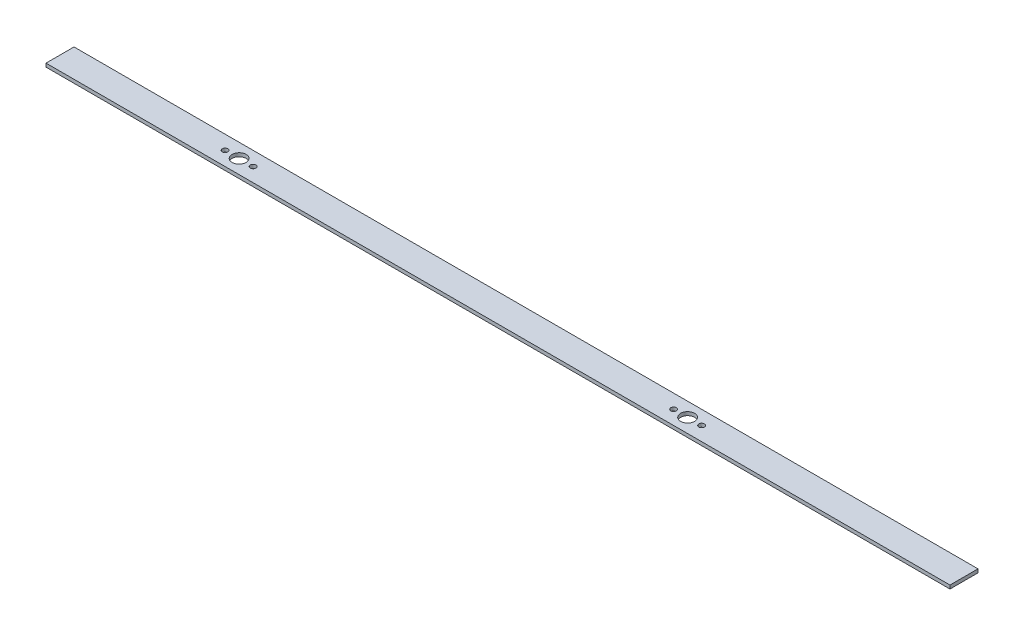
ISO-10303-21;
HEADER;
FILE_DESCRIPTION(('STEP AP214'),'2;1');
FILE_NAME('part.step','',(''),(''),'','','');
FILE_SCHEMA(('AUTOMOTIVE_DESIGN { 1 0 10303 214 1 1 1 1 }'));
ENDSEC;
DATA;
#1=APPLICATION_CONTEXT('core data for automotive mechanical design processes');
#2=APPLICATION_PROTOCOL_DEFINITION('international standard','automotive_design',2000,#1);
#3=PRODUCT_CONTEXT('',#1,'mechanical');
#4=PRODUCT('Part','Part','',(#3));
#5=PRODUCT_RELATED_PRODUCT_CATEGORY('part','',(#4));
#6=PRODUCT_DEFINITION_FORMATION('','',#4);
#7=PRODUCT_DEFINITION_CONTEXT('part definition',#1,'design');
#8=PRODUCT_DEFINITION('design','',#6,#7);
#9=PRODUCT_DEFINITION_SHAPE('','',#8);
#10=(LENGTH_UNIT() NAMED_UNIT(*) SI_UNIT(.MILLI.,.METRE.));
#11=(NAMED_UNIT(*) PLANE_ANGLE_UNIT() SI_UNIT($,.RADIAN.));
#12=(NAMED_UNIT(*) SI_UNIT($,.STERADIAN.) SOLID_ANGLE_UNIT());
#13=UNCERTAINTY_MEASURE_WITH_UNIT(LENGTH_MEASURE(1.E-05),#10,'distance_accuracy_value','');
#14=(GEOMETRIC_REPRESENTATION_CONTEXT(3) GLOBAL_UNCERTAINTY_ASSIGNED_CONTEXT((#13)) GLOBAL_UNIT_ASSIGNED_CONTEXT((#10,
#11,#12)) REPRESENTATION_CONTEXT('',''));
#15=CARTESIAN_POINT('',(0.,0.,0.));
#16=DIRECTION('',(0.,0.,1.));
#17=DIRECTION('',(1.,0.,0.));
#18=AXIS2_PLACEMENT_3D('',#15,#16,#17);
#19=CARTESIAN_POINT('',(0.,3.175,0.));
#20=DIRECTION('',(1.,0.,0.));
#21=DIRECTION('',(0.,0.,-1.));
#22=AXIS2_PLACEMENT_3D('',#19,#20,#21);
#23=PLANE('',#22);
#24=DIRECTION('',(0.,0.,1.));
#25=VECTOR('',#24,1.);
#26=CARTESIAN_POINT('',(0.,0.,0.));
#27=LINE('',#26,#25);
#28=CARTESIAN_POINT('',(0.,0.,-25.4));
#29=VERTEX_POINT('',#28);
#30=CARTESIAN_POINT('',(0.,0.,0.));
#31=VERTEX_POINT('',#30);
#32=EDGE_CURVE('E115',#29,#31,#27,.T.);
#33=ORIENTED_EDGE('',*,*,#32,.T.);
#34=DIRECTION('',(0.,-1.,0.));
#35=VECTOR('',#34,1.);
#36=CARTESIAN_POINT('',(0.,3.175,0.));
#37=LINE('',#36,#35);
#38=CARTESIAN_POINT('',(0.,3.175,0.));
#39=VERTEX_POINT('',#38);
#40=EDGE_CURVE('E11',#39,#31,#37,.T.);
#41=ORIENTED_EDGE('',*,*,#40,.F.);
#42=DIRECTION('',(0.,0.,1.));
#43=VECTOR('',#42,1.);
#44=CARTESIAN_POINT('',(0.,3.175,0.));
#45=LINE('',#44,#43);
#46=CARTESIAN_POINT('',(0.,3.175,-25.4));
#47=VERTEX_POINT('',#46);
#48=EDGE_CURVE('E98',#47,#39,#45,.T.);
#49=ORIENTED_EDGE('',*,*,#48,.F.);
#50=DIRECTION('',(0.,-1.,0.));
#51=VECTOR('',#50,1.);
#52=CARTESIAN_POINT('',(0.,3.175,-25.4));
#53=LINE('',#52,#51);
#54=EDGE_CURVE('E111',#47,#29,#53,.T.);
#55=ORIENTED_EDGE('',*,*,#54,.T.);
#56=EDGE_LOOP('',(#33,#41,#49,#55));
#57=FACE_BOUND('',#56,.T.);
#58=ADVANCED_FACE('F41',(#57),#23,.F.);
#59=CARTESIAN_POINT('',(0.,3.175,0.));
#60=DIRECTION('',(0.,0.,-1.));
#61=DIRECTION('',(-1.,0.,0.));
#62=AXIS2_PLACEMENT_3D('',#59,#60,#61);
#63=PLANE('',#62);
#64=DIRECTION('',(1.,0.,0.));
#65=VECTOR('',#64,1.);
#66=CARTESIAN_POINT('',(0.,0.,0.));
#67=LINE('',#66,#65);
#68=CARTESIAN_POINT('',(819.15,0.,0.));
#69=VERTEX_POINT('',#68);
#70=EDGE_CURVE('E103',#31,#69,#67,.T.);
#71=ORIENTED_EDGE('',*,*,#70,.T.);
#72=DIRECTION('',(0.,-1.,0.));
#73=VECTOR('',#72,1.);
#74=CARTESIAN_POINT('',(819.15,3.175,0.));
#75=LINE('',#74,#73);
#76=CARTESIAN_POINT('',(819.15,3.175,0.));
#77=VERTEX_POINT('',#76);
#78=EDGE_CURVE('E50',#77,#69,#75,.T.);
#79=ORIENTED_EDGE('',*,*,#78,.F.);
#80=DIRECTION('',(1.,0.,0.));
#81=VECTOR('',#80,1.);
#82=CARTESIAN_POINT('',(0.,3.175,0.));
#83=LINE('',#82,#81);
#84=EDGE_CURVE('E93',#39,#77,#83,.T.);
#85=ORIENTED_EDGE('',*,*,#84,.F.);
#86=ORIENTED_EDGE('',*,*,#40,.T.);
#87=EDGE_LOOP('',(#71,#79,#85,#86));
#88=FACE_BOUND('',#87,.T.);
#89=ADVANCED_FACE('F102',(#88),#63,.F.);
#90=CARTESIAN_POINT('',(819.15,3.175,0.));
#91=DIRECTION('',(-1.,0.,0.));
#92=DIRECTION('',(0.,0.,1.));
#93=AXIS2_PLACEMENT_3D('',#90,#91,#92);
#94=PLANE('',#93);
#95=DIRECTION('',(0.,0.,-1.));
#96=VECTOR('',#95,1.);
#97=CARTESIAN_POINT('',(819.15,0.,0.));
#98=LINE('',#97,#96);
#99=CARTESIAN_POINT('',(819.15,0.,-25.4));
#100=VERTEX_POINT('',#99);
#101=EDGE_CURVE('E79',#69,#100,#98,.T.);
#102=ORIENTED_EDGE('',*,*,#101,.T.);
#103=DIRECTION('',(0.,-1.,0.));
#104=VECTOR('',#103,1.);
#105=CARTESIAN_POINT('',(819.15,3.175,-25.4));
#106=LINE('',#105,#104);
#107=CARTESIAN_POINT('',(819.15,3.175,-25.4));
#108=VERTEX_POINT('',#107);
#109=EDGE_CURVE('E104',#108,#100,#106,.T.);
#110=ORIENTED_EDGE('',*,*,#109,.F.);
#111=DIRECTION('',(0.,0.,-1.));
#112=VECTOR('',#111,1.);
#113=CARTESIAN_POINT('',(819.15,3.175,0.));
#114=LINE('',#113,#112);
#115=EDGE_CURVE('E96',#77,#108,#114,.T.);
#116=ORIENTED_EDGE('',*,*,#115,.F.);
#117=ORIENTED_EDGE('',*,*,#78,.T.);
#118=EDGE_LOOP('',(#102,#110,#116,#117));
#119=FACE_BOUND('',#118,.T.);
#120=ADVANCED_FACE('F105',(#119),#94,.F.);
#121=CARTESIAN_POINT('',(0.,3.175,-25.4));
#122=DIRECTION('',(0.,0.,1.));
#123=DIRECTION('',(1.,0.,0.));
#124=AXIS2_PLACEMENT_3D('',#121,#122,#123);
#125=PLANE('',#124);
#126=DIRECTION('',(-1.,0.,0.));
#127=VECTOR('',#126,1.);
#128=CARTESIAN_POINT('',(0.,0.,-25.4));
#129=LINE('',#128,#127);
#130=EDGE_CURVE('E86',#100,#29,#129,.T.);
#131=ORIENTED_EDGE('',*,*,#130,.T.);
#132=ORIENTED_EDGE('',*,*,#54,.F.);
#133=DIRECTION('',(-1.,0.,0.));
#134=VECTOR('',#133,1.);
#135=CARTESIAN_POINT('',(0.,3.175,-25.4));
#136=LINE('',#135,#134);
#137=EDGE_CURVE('E60',#108,#47,#136,.T.);
#138=ORIENTED_EDGE('',*,*,#137,.F.);
#139=ORIENTED_EDGE('',*,*,#109,.T.);
#140=EDGE_LOOP('',(#131,#132,#138,#139));
#141=FACE_BOUND('',#140,.T.);
#142=ADVANCED_FACE('F126',(#141),#125,.F.);
#143=CARTESIAN_POINT('',(0.,3.175,0.));
#144=DIRECTION('',(0.,-1.,0.));
#145=DIRECTION('',(0.,0.,-1.));
#146=AXIS2_PLACEMENT_3D('',#143,#144,#145);
#147=PLANE('',#146);
#148=CARTESIAN_POINT('',(568.697837435288,3.175,-12.7));
#149=DIRECTION('',(0.,1.,0.));
#150=DIRECTION('',(0.,0.,1.));
#151=AXIS2_PLACEMENT_3D('',#148,#149,#150);
#152=CIRCLE('',#151,6.34999999999994);
#153=CARTESIAN_POINT('',(568.697837435288,3.175,-6.35000000000006));
#154=VERTEX_POINT('',#153);
#155=EDGE_CURVE('E173',#154,#154,#152,.T.);
#156=ORIENTED_EDGE('',*,*,#155,.F.);
#157=EDGE_LOOP('',(#156));
#158=FACE_BOUND('',#157,.T.);
#159=CARTESIAN_POINT('',(162.29783743528,3.175,-12.7));
#160=DIRECTION('',(0.,1.,0.));
#161=DIRECTION('',(0.,0.,1.));
#162=AXIS2_PLACEMENT_3D('',#159,#160,#161);
#163=CIRCLE('',#162,6.35);
#164=CARTESIAN_POINT('',(162.29783743528,3.175,-6.35000000000001));
#165=VERTEX_POINT('',#164);
#166=EDGE_CURVE('E165',#165,#165,#163,.T.);
#167=ORIENTED_EDGE('',*,*,#166,.F.);
#168=EDGE_LOOP('',(#167));
#169=FACE_BOUND('',#168,.T.);
#170=CARTESIAN_POINT('',(581.397837435288,3.175,-12.7));
#171=DIRECTION('',(0.,1.,0.));
#172=DIRECTION('',(0.,0.,1.));
#173=AXIS2_PLACEMENT_3D('',#170,#171,#172);
#174=CIRCLE('',#173,2.51460000000001);
#175=CARTESIAN_POINT('',(581.397837435288,3.175,-10.1854));
#176=VERTEX_POINT('',#175);
#177=EDGE_CURVE('E157',#176,#176,#174,.T.);
#178=ORIENTED_EDGE('',*,*,#177,.F.);
#179=EDGE_LOOP('',(#178));
#180=FACE_BOUND('',#179,.T.);
#181=CARTESIAN_POINT('',(555.997837435288,3.175,-12.7));
#182=DIRECTION('',(0.,1.,0.));
#183=DIRECTION('',(0.,0.,1.));
#184=AXIS2_PLACEMENT_3D('',#181,#182,#183);
#185=CIRCLE('',#184,2.51460000000001);
#186=CARTESIAN_POINT('',(555.997837435288,3.175,-10.1854));
#187=VERTEX_POINT('',#186);
#188=EDGE_CURVE('E149',#187,#187,#185,.T.);
#189=ORIENTED_EDGE('',*,*,#188,.F.);
#190=EDGE_LOOP('',(#189));
#191=FACE_BOUND('',#190,.T.);
#192=CARTESIAN_POINT('',(174.997837435281,3.175,-12.7));
#193=DIRECTION('',(0.,1.,0.));
#194=DIRECTION('',(0.,0.,1.));
#195=AXIS2_PLACEMENT_3D('',#192,#193,#194);
#196=CIRCLE('',#195,2.51459999999998);
#197=CARTESIAN_POINT('',(174.997837435281,3.175,-10.1854));
#198=VERTEX_POINT('',#197);
#199=EDGE_CURVE('E141',#198,#198,#196,.T.);
#200=ORIENTED_EDGE('',*,*,#199,.F.);
#201=EDGE_LOOP('',(#200));
#202=FACE_BOUND('',#201,.T.);
#203=CARTESIAN_POINT('',(149.59783743528,3.175,-12.7));
#204=DIRECTION('',(0.,1.,0.));
#205=DIRECTION('',(0.,0.,1.));
#206=AXIS2_PLACEMENT_3D('',#203,#204,#205);
#207=CIRCLE('',#206,2.51459999999998);
#208=CARTESIAN_POINT('',(149.59783743528,3.175,-10.1854));
#209=VERTEX_POINT('',#208);
#210=EDGE_CURVE('E133',#209,#209,#207,.T.);
#211=ORIENTED_EDGE('',*,*,#210,.F.);
#212=EDGE_LOOP('',(#211));
#213=FACE_BOUND('',#212,.T.);
#214=ORIENTED_EDGE('',*,*,#48,.T.);
#215=ORIENTED_EDGE('',*,*,#84,.T.);
#216=ORIENTED_EDGE('',*,*,#115,.T.);
#217=ORIENTED_EDGE('',*,*,#137,.T.);
#218=EDGE_LOOP('',(#214,#215,#216,#217));
#219=FACE_BOUND('',#218,.T.);
#220=ADVANCED_FACE('F94',(#158,#169,#180,#191,#202,#213,#219),#147,.F.);
#221=CARTESIAN_POINT('',(0.,0.,0.));
#222=DIRECTION('',(0.,-1.,0.));
#223=DIRECTION('',(0.,0.,-1.));
#224=AXIS2_PLACEMENT_3D('',#221,#222,#223);
#225=PLANE('',#224);
#226=CARTESIAN_POINT('',(568.697837435288,0.,-12.7));
#227=DIRECTION('',(0.,1.,0.));
#228=DIRECTION('',(0.,0.,1.));
#229=AXIS2_PLACEMENT_3D('',#226,#227,#228);
#230=CIRCLE('',#229,6.34999999999994);
#231=CARTESIAN_POINT('',(568.697837435288,0.,-6.35000000000006));
#232=VERTEX_POINT('',#231);
#233=EDGE_CURVE('E169',#232,#232,#230,.T.);
#234=ORIENTED_EDGE('',*,*,#233,.T.);
#235=EDGE_LOOP('',(#234));
#236=FACE_BOUND('',#235,.T.);
#237=CARTESIAN_POINT('',(162.29783743528,0.,-12.7));
#238=DIRECTION('',(0.,1.,0.));
#239=DIRECTION('',(0.,0.,1.));
#240=AXIS2_PLACEMENT_3D('',#237,#238,#239);
#241=CIRCLE('',#240,6.35);
#242=CARTESIAN_POINT('',(162.29783743528,0.,-6.35000000000001));
#243=VERTEX_POINT('',#242);
#244=EDGE_CURVE('E161',#243,#243,#241,.T.);
#245=ORIENTED_EDGE('',*,*,#244,.T.);
#246=EDGE_LOOP('',(#245));
#247=FACE_BOUND('',#246,.T.);
#248=CARTESIAN_POINT('',(581.397837435288,0.,-12.7));
#249=DIRECTION('',(0.,1.,0.));
#250=DIRECTION('',(0.,0.,1.));
#251=AXIS2_PLACEMENT_3D('',#248,#249,#250);
#252=CIRCLE('',#251,2.51460000000001);
#253=CARTESIAN_POINT('',(581.397837435288,0.,-10.1854));
#254=VERTEX_POINT('',#253);
#255=EDGE_CURVE('E153',#254,#254,#252,.T.);
#256=ORIENTED_EDGE('',*,*,#255,.T.);
#257=EDGE_LOOP('',(#256));
#258=FACE_BOUND('',#257,.T.);
#259=CARTESIAN_POINT('',(555.997837435288,0.,-12.7));
#260=DIRECTION('',(0.,1.,0.));
#261=DIRECTION('',(0.,0.,1.));
#262=AXIS2_PLACEMENT_3D('',#259,#260,#261);
#263=CIRCLE('',#262,2.51460000000001);
#264=CARTESIAN_POINT('',(555.997837435288,0.,-10.1854));
#265=VERTEX_POINT('',#264);
#266=EDGE_CURVE('E145',#265,#265,#263,.T.);
#267=ORIENTED_EDGE('',*,*,#266,.T.);
#268=EDGE_LOOP('',(#267));
#269=FACE_BOUND('',#268,.T.);
#270=CARTESIAN_POINT('',(174.997837435281,0.,-12.7));
#271=DIRECTION('',(0.,1.,0.));
#272=DIRECTION('',(0.,0.,1.));
#273=AXIS2_PLACEMENT_3D('',#270,#271,#272);
#274=CIRCLE('',#273,2.51459999999998);
#275=CARTESIAN_POINT('',(174.997837435281,0.,-10.1854));
#276=VERTEX_POINT('',#275);
#277=EDGE_CURVE('E137',#276,#276,#274,.T.);
#278=ORIENTED_EDGE('',*,*,#277,.T.);
#279=EDGE_LOOP('',(#278));
#280=FACE_BOUND('',#279,.T.);
#281=CARTESIAN_POINT('',(149.59783743528,0.,-12.7));
#282=DIRECTION('',(0.,1.,0.));
#283=DIRECTION('',(0.,0.,1.));
#284=AXIS2_PLACEMENT_3D('',#281,#282,#283);
#285=CIRCLE('',#284,2.51459999999998);
#286=CARTESIAN_POINT('',(149.59783743528,0.,-10.1854));
#287=VERTEX_POINT('',#286);
#288=EDGE_CURVE('E118',#287,#287,#285,.T.);
#289=ORIENTED_EDGE('',*,*,#288,.T.);
#290=EDGE_LOOP('',(#289));
#291=FACE_BOUND('',#290,.T.);
#292=ORIENTED_EDGE('',*,*,#32,.F.);
#293=ORIENTED_EDGE('',*,*,#130,.F.);
#294=ORIENTED_EDGE('',*,*,#101,.F.);
#295=ORIENTED_EDGE('',*,*,#70,.F.);
#296=EDGE_LOOP('',(#292,#293,#294,#295));
#297=FACE_BOUND('',#296,.T.);
#298=ADVANCED_FACE('F129',(#236,#247,#258,#269,#280,#291,#297),#225,.T.);
#299=CARTESIAN_POINT('',(149.59783743528,0.,-12.7));
#300=DIRECTION('',(0.,1.,0.));
#301=DIRECTION('',(0.,0.,1.));
#302=AXIS2_PLACEMENT_3D('',#299,#300,#301);
#303=CYLINDRICAL_SURFACE('',#302,2.51459999999998);
#304=ORIENTED_EDGE('',*,*,#288,.F.);
#305=EDGE_LOOP('',(#304));
#306=FACE_BOUND('',#305,.T.);
#307=ORIENTED_EDGE('',*,*,#210,.T.);
#308=EDGE_LOOP('',(#307));
#309=FACE_BOUND('',#308,.T.);
#310=ADVANCED_FACE('F203',(#306,#309),#303,.F.);
#311=CARTESIAN_POINT('',(174.997837435281,0.,-12.7));
#312=DIRECTION('',(0.,1.,0.));
#313=DIRECTION('',(0.,0.,1.));
#314=AXIS2_PLACEMENT_3D('',#311,#312,#313);
#315=CYLINDRICAL_SURFACE('',#314,2.51459999999998);
#316=ORIENTED_EDGE('',*,*,#277,.F.);
#317=EDGE_LOOP('',(#316));
#318=FACE_BOUND('',#317,.T.);
#319=ORIENTED_EDGE('',*,*,#199,.T.);
#320=EDGE_LOOP('',(#319));
#321=FACE_BOUND('',#320,.T.);
#322=ADVANCED_FACE('F205',(#318,#321),#315,.F.);
#323=CARTESIAN_POINT('',(555.997837435288,0.,-12.7));
#324=DIRECTION('',(0.,1.,0.));
#325=DIRECTION('',(0.,0.,1.));
#326=AXIS2_PLACEMENT_3D('',#323,#324,#325);
#327=CYLINDRICAL_SURFACE('',#326,2.51460000000001);
#328=ORIENTED_EDGE('',*,*,#266,.F.);
#329=EDGE_LOOP('',(#328));
#330=FACE_BOUND('',#329,.T.);
#331=ORIENTED_EDGE('',*,*,#188,.T.);
#332=EDGE_LOOP('',(#331));
#333=FACE_BOUND('',#332,.T.);
#334=ADVANCED_FACE('F212',(#330,#333),#327,.F.);
#335=CARTESIAN_POINT('',(581.397837435288,0.,-12.7));
#336=DIRECTION('',(0.,1.,0.));
#337=DIRECTION('',(0.,0.,1.));
#338=AXIS2_PLACEMENT_3D('',#335,#336,#337);
#339=CYLINDRICAL_SURFACE('',#338,2.51460000000001);
#340=ORIENTED_EDGE('',*,*,#255,.F.);
#341=EDGE_LOOP('',(#340));
#342=FACE_BOUND('',#341,.T.);
#343=ORIENTED_EDGE('',*,*,#177,.T.);
#344=EDGE_LOOP('',(#343));
#345=FACE_BOUND('',#344,.T.);
#346=ADVANCED_FACE('F260',(#342,#345),#339,.F.);
#347=CARTESIAN_POINT('',(162.29783743528,0.,-12.7));
#348=DIRECTION('',(0.,1.,0.));
#349=DIRECTION('',(0.,0.,1.));
#350=AXIS2_PLACEMENT_3D('',#347,#348,#349);
#351=CYLINDRICAL_SURFACE('',#350,6.35);
#352=ORIENTED_EDGE('',*,*,#244,.F.);
#353=EDGE_LOOP('',(#352));
#354=FACE_BOUND('',#353,.T.);
#355=ORIENTED_EDGE('',*,*,#166,.T.);
#356=EDGE_LOOP('',(#355));
#357=FACE_BOUND('',#356,.T.);
#358=ADVANCED_FACE('F186',(#354,#357),#351,.F.);
#359=CARTESIAN_POINT('',(568.697837435288,0.,-12.7));
#360=DIRECTION('',(0.,1.,0.));
#361=DIRECTION('',(0.,0.,1.));
#362=AXIS2_PLACEMENT_3D('',#359,#360,#361);
#363=CYLINDRICAL_SURFACE('',#362,6.34999999999994);
#364=ORIENTED_EDGE('',*,*,#233,.F.);
#365=EDGE_LOOP('',(#364));
#366=FACE_BOUND('',#365,.T.);
#367=ORIENTED_EDGE('',*,*,#155,.T.);
#368=EDGE_LOOP('',(#367));
#369=FACE_BOUND('',#368,.T.);
#370=ADVANCED_FACE('F183',(#366,#369),#363,.F.);
#371=CLOSED_SHELL('',(#58,#89,#120,#142,#220,#298,#310,#322,#334,#346,#358,#370));
#372=MANIFOLD_SOLID_BREP('B2',#371);
#373=ADVANCED_BREP_SHAPE_REPRESENTATION('',(#18,#372),#14);
#374=SHAPE_DEFINITION_REPRESENTATION(#9,#373);
ENDSEC;
END-ISO-10303-21;
